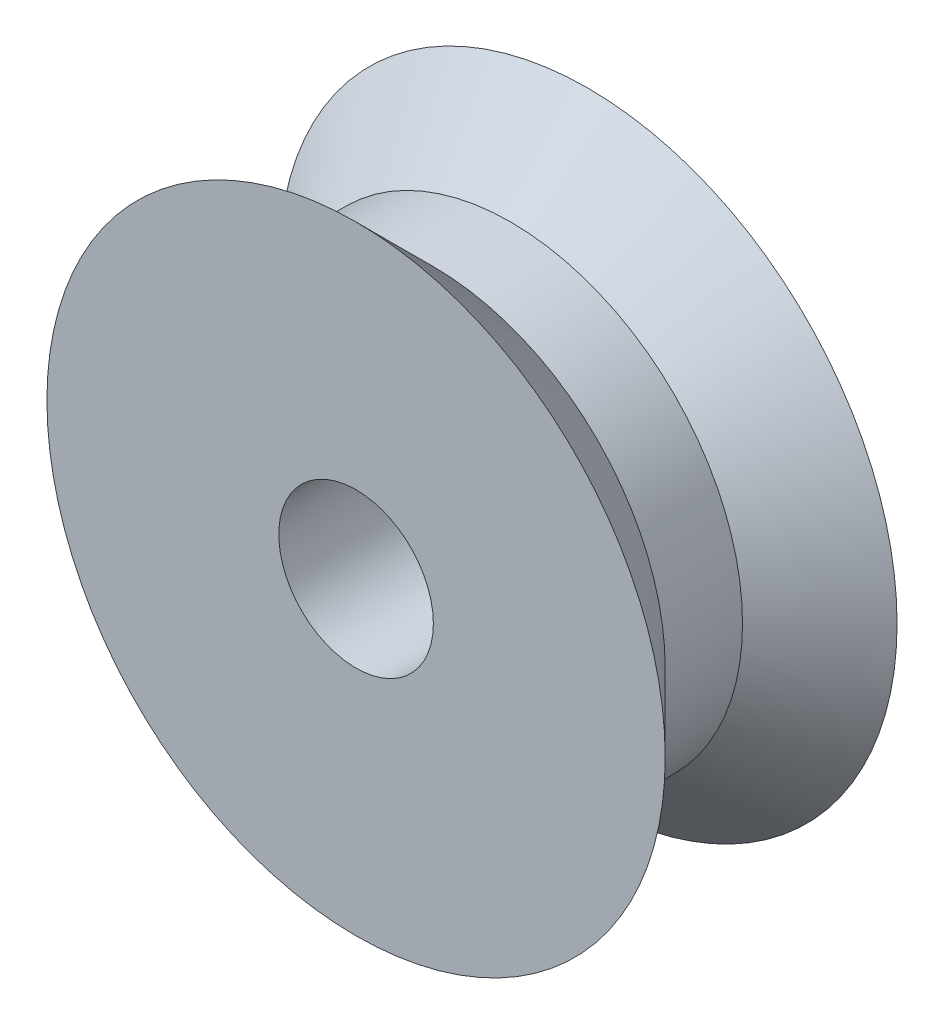
ISO-10303-21;
HEADER;
FILE_DESCRIPTION(('STEP AP214'),'2;1');
FILE_NAME('part.step','',(''),(''),'','','');
FILE_SCHEMA(('AUTOMOTIVE_DESIGN { 1 0 10303 214 1 1 1 1 }'));
ENDSEC;
DATA;
#1=APPLICATION_CONTEXT('core data for automotive mechanical design processes');
#2=APPLICATION_PROTOCOL_DEFINITION('international standard','automotive_design',2000,#1);
#3=PRODUCT_CONTEXT('',#1,'mechanical');
#4=PRODUCT('Part','Part','',(#3));
#5=PRODUCT_RELATED_PRODUCT_CATEGORY('part','',(#4));
#6=PRODUCT_DEFINITION_FORMATION('','',#4);
#7=PRODUCT_DEFINITION_CONTEXT('part definition',#1,'design');
#8=PRODUCT_DEFINITION('design','',#6,#7);
#9=PRODUCT_DEFINITION_SHAPE('','',#8);
#10=(LENGTH_UNIT() NAMED_UNIT(*) SI_UNIT(.MILLI.,.METRE.));
#11=(NAMED_UNIT(*) PLANE_ANGLE_UNIT() SI_UNIT($,.RADIAN.));
#12=(NAMED_UNIT(*) SI_UNIT($,.STERADIAN.) SOLID_ANGLE_UNIT());
#13=UNCERTAINTY_MEASURE_WITH_UNIT(LENGTH_MEASURE(1.E-05),#10,'distance_accuracy_value','');
#14=(GEOMETRIC_REPRESENTATION_CONTEXT(3) GLOBAL_UNCERTAINTY_ASSIGNED_CONTEXT((#13)) GLOBAL_UNIT_ASSIGNED_CONTEXT((#10,
#11,#12)) REPRESENTATION_CONTEXT('',''));
#15=CARTESIAN_POINT('',(0.,0.,0.));
#16=DIRECTION('',(0.,0.,1.));
#17=DIRECTION('',(1.,0.,0.));
#18=AXIS2_PLACEMENT_3D('',#15,#16,#17);
#19=CARTESIAN_POINT('',(0.,0.,30.));
#20=DIRECTION('',(0.,0.,1.));
#21=DIRECTION('',(1.,0.,0.));
#22=AXIS2_PLACEMENT_3D('',#19,#20,#21);
#23=PLANE('',#22);
#24=CARTESIAN_POINT('',(0.,0.,30.));
#25=DIRECTION('',(0.,0.,-1.));
#26=DIRECTION('',(-1.,0.,0.));
#27=AXIS2_PLACEMENT_3D('',#24,#25,#26);
#28=CIRCLE('',#27,40.);
#29=CARTESIAN_POINT('',(-40.,0.,30.));
#30=VERTEX_POINT('',#29);
#31=EDGE_CURVE('E52',#30,#30,#28,.T.);
#32=ORIENTED_EDGE('',*,*,#31,.F.);
#33=EDGE_LOOP('',(#32));
#34=FACE_BOUND('',#33,.T.);
#35=CARTESIAN_POINT('',(0.,0.,30.));
#36=DIRECTION('',(0.,0.,1.));
#37=DIRECTION('',(1.,0.,0.));
#38=AXIS2_PLACEMENT_3D('',#35,#36,#37);
#39=CIRCLE('',#38,10.);
#40=CARTESIAN_POINT('',(10.,0.,30.));
#41=VERTEX_POINT('',#40);
#42=EDGE_CURVE('E10',#41,#41,#39,.T.);
#43=ORIENTED_EDGE('',*,*,#42,.F.);
#44=EDGE_LOOP('',(#43));
#45=FACE_BOUND('',#44,.T.);
#46=ADVANCED_FACE('F31',(#34,#45),#23,.T.);
#47=CARTESIAN_POINT('',(0.,0.,0.));
#48=DIRECTION('',(0.,0.,1.));
#49=DIRECTION('',(1.,0.,0.));
#50=AXIS2_PLACEMENT_3D('',#47,#48,#49);
#51=PLANE('',#50);
#52=CARTESIAN_POINT('',(0.,0.,0.));
#53=DIRECTION('',(0.,0.,-1.));
#54=DIRECTION('',(-1.,0.,0.));
#55=AXIS2_PLACEMENT_3D('',#52,#53,#54);
#56=CIRCLE('',#55,40.);
#57=CARTESIAN_POINT('',(-40.,0.,0.));
#58=VERTEX_POINT('',#57);
#59=EDGE_CURVE('E49',#58,#58,#56,.T.);
#60=ORIENTED_EDGE('',*,*,#59,.T.);
#61=EDGE_LOOP('',(#60));
#62=FACE_BOUND('',#61,.T.);
#63=CARTESIAN_POINT('',(0.,0.,0.));
#64=DIRECTION('',(0.,0.,1.));
#65=DIRECTION('',(1.,0.,0.));
#66=AXIS2_PLACEMENT_3D('',#63,#64,#65);
#67=CIRCLE('',#66,10.);
#68=CARTESIAN_POINT('',(10.,0.,0.));
#69=VERTEX_POINT('',#68);
#70=EDGE_CURVE('E35',#69,#69,#67,.T.);
#71=ORIENTED_EDGE('',*,*,#70,.T.);
#72=EDGE_LOOP('',(#71));
#73=FACE_BOUND('',#72,.T.);
#74=ADVANCED_FACE('F33',(#62,#73),#51,.F.);
#75=CARTESIAN_POINT('',(0.,0.,30.));
#76=DIRECTION('',(0.,0.,-1.));
#77=DIRECTION('',(-1.,0.,0.));
#78=AXIS2_PLACEMENT_3D('',#75,#76,#77);
#79=CYLINDRICAL_SURFACE('',#78,10.);
#80=ORIENTED_EDGE('',*,*,#42,.T.);
#81=EDGE_LOOP('',(#80));
#82=FACE_BOUND('',#81,.T.);
#83=ORIENTED_EDGE('',*,*,#70,.F.);
#84=EDGE_LOOP('',(#83));
#85=FACE_BOUND('',#84,.T.);
#86=ADVANCED_FACE('F64',(#82,#85),#79,.F.);
#87=CARTESIAN_POINT('',(0.,0.,20.));
#88=DIRECTION('',(0.,0.,1.));
#89=DIRECTION('',(1.,0.,0.));
#90=AXIS2_PLACEMENT_3D('',#87,#88,#89);
#91=CONICAL_SURFACE('',#90,30.,0.78539816339745);
#92=ORIENTED_EDGE('',*,*,#31,.T.);
#93=EDGE_LOOP('',(#92));
#94=FACE_BOUND('',#93,.T.);
#95=CARTESIAN_POINT('',(0.,0.,20.));
#96=DIRECTION('',(0.,0.,-1.));
#97=DIRECTION('',(-1.,0.,0.));
#98=AXIS2_PLACEMENT_3D('',#95,#96,#97);
#99=CIRCLE('',#98,30.);
#100=CARTESIAN_POINT('',(-30.,0.,20.));
#101=VERTEX_POINT('',#100);
#102=EDGE_CURVE('E42',#101,#101,#99,.T.);
#103=ORIENTED_EDGE('',*,*,#102,.F.);
#104=EDGE_LOOP('',(#103));
#105=FACE_BOUND('',#104,.T.);
#106=ADVANCED_FACE('F56',(#94,#105),#91,.T.);
#107=CARTESIAN_POINT('',(0.,0.,0.));
#108=DIRECTION('',(0.,0.,-1.));
#109=DIRECTION('',(-1.,0.,0.));
#110=AXIS2_PLACEMENT_3D('',#107,#108,#109);
#111=CYLINDRICAL_SURFACE('',#110,30.);
#112=ORIENTED_EDGE('',*,*,#102,.T.);
#113=EDGE_LOOP('',(#112));
#114=FACE_BOUND('',#113,.T.);
#115=CARTESIAN_POINT('',(0.,0.,10.));
#116=DIRECTION('',(0.,0.,-1.));
#117=DIRECTION('',(-1.,0.,0.));
#118=AXIS2_PLACEMENT_3D('',#115,#116,#117);
#119=CIRCLE('',#118,30.);
#120=CARTESIAN_POINT('',(-30.,0.,10.));
#121=VERTEX_POINT('',#120);
#122=EDGE_CURVE('E46',#121,#121,#119,.T.);
#123=ORIENTED_EDGE('',*,*,#122,.F.);
#124=EDGE_LOOP('',(#123));
#125=FACE_BOUND('',#124,.T.);
#126=ADVANCED_FACE('F71',(#114,#125),#111,.T.);
#127=CARTESIAN_POINT('',(0.,0.,0.));
#128=DIRECTION('',(0.,0.,-1.));
#129=DIRECTION('',(-1.,0.,0.));
#130=AXIS2_PLACEMENT_3D('',#127,#128,#129);
#131=CONICAL_SURFACE('',#130,40.,0.78539816339745);
#132=ORIENTED_EDGE('',*,*,#122,.T.);
#133=EDGE_LOOP('',(#132));
#134=FACE_BOUND('',#133,.T.);
#135=ORIENTED_EDGE('',*,*,#59,.F.);
#136=EDGE_LOOP('',(#135));
#137=FACE_BOUND('',#136,.T.);
#138=ADVANCED_FACE('F74',(#134,#137),#131,.T.);
#139=CLOSED_SHELL('',(#46,#74,#86,#106,#126,#138));
#140=MANIFOLD_SOLID_BREP('B2',#139);
#141=ADVANCED_BREP_SHAPE_REPRESENTATION('',(#18,#140),#14);
#142=SHAPE_DEFINITION_REPRESENTATION(#9,#141);
ENDSEC;
END-ISO-10303-21;
